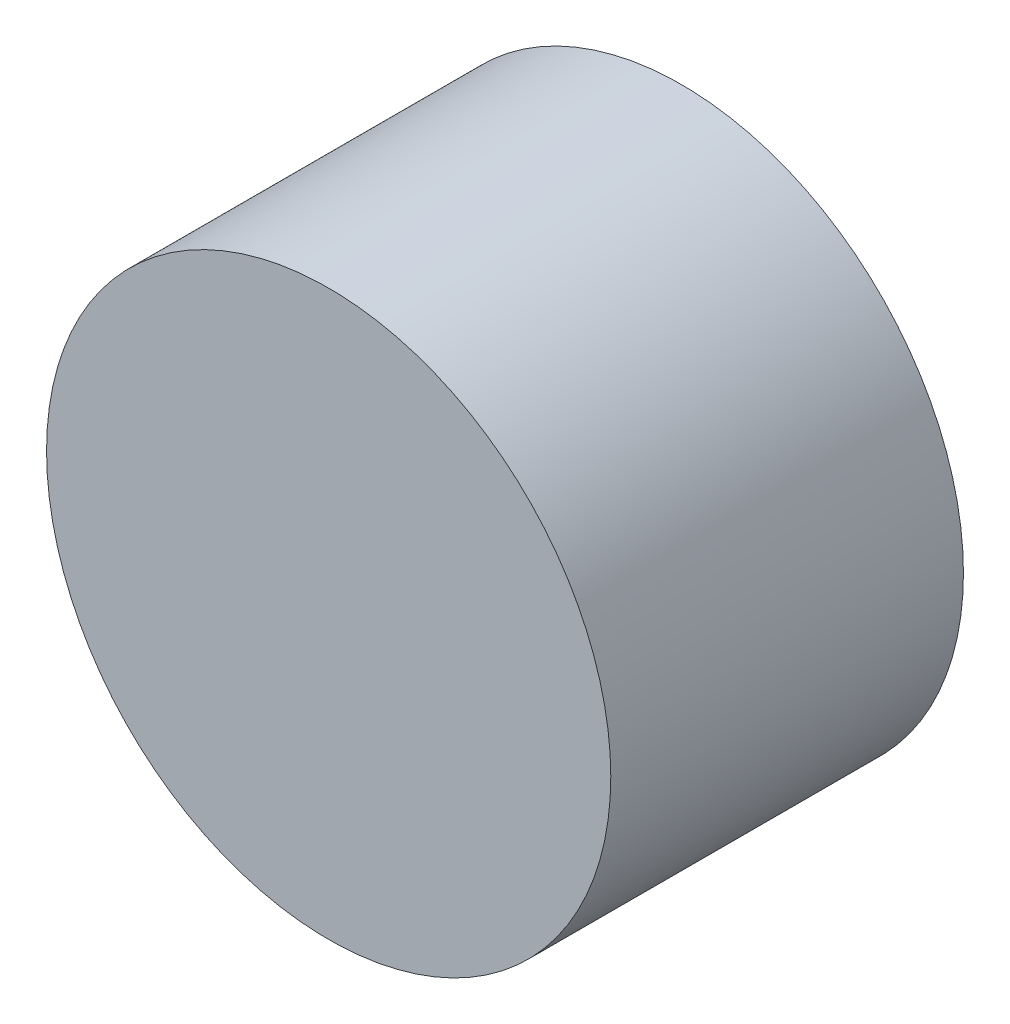
ISO-10303-21;
HEADER;
FILE_DESCRIPTION(('STEP AP214'),'2;1');
FILE_NAME('part.step','',(''),(''),'','','');
FILE_SCHEMA(('AUTOMOTIVE_DESIGN { 1 0 10303 214 1 1 1 1 }'));
ENDSEC;
DATA;
#1=APPLICATION_CONTEXT('core data for automotive mechanical design processes');
#2=APPLICATION_PROTOCOL_DEFINITION('international standard','automotive_design',2000,#1);
#3=PRODUCT_CONTEXT('',#1,'mechanical');
#4=PRODUCT('Part','Part','',(#3));
#5=PRODUCT_RELATED_PRODUCT_CATEGORY('part','',(#4));
#6=PRODUCT_DEFINITION_FORMATION('','',#4);
#7=PRODUCT_DEFINITION_CONTEXT('part definition',#1,'design');
#8=PRODUCT_DEFINITION('design','',#6,#7);
#9=PRODUCT_DEFINITION_SHAPE('','',#8);
#10=(LENGTH_UNIT() NAMED_UNIT(*) SI_UNIT(.MILLI.,.METRE.));
#11=(NAMED_UNIT(*) PLANE_ANGLE_UNIT() SI_UNIT($,.RADIAN.));
#12=(NAMED_UNIT(*) SI_UNIT($,.STERADIAN.) SOLID_ANGLE_UNIT());
#13=UNCERTAINTY_MEASURE_WITH_UNIT(LENGTH_MEASURE(1.E-05),#10,'distance_accuracy_value','');
#14=(GEOMETRIC_REPRESENTATION_CONTEXT(3) GLOBAL_UNCERTAINTY_ASSIGNED_CONTEXT((#13)) GLOBAL_UNIT_ASSIGNED_CONTEXT((#10,
#11,#12)) REPRESENTATION_CONTEXT('',''));
#15=CARTESIAN_POINT('',(0.,0.,0.));
#16=DIRECTION('',(0.,0.,1.));
#17=DIRECTION('',(1.,0.,0.));
#18=AXIS2_PLACEMENT_3D('',#15,#16,#17);
#19=CARTESIAN_POINT('',(0.,0.,5.));
#20=DIRECTION('',(0.,0.,-1.));
#21=DIRECTION('',(-1.,0.,0.));
#22=AXIS2_PLACEMENT_3D('',#19,#20,#21);
#23=CYLINDRICAL_SURFACE('',#22,4.);
#24=CARTESIAN_POINT('',(0.,0.,5.));
#25=DIRECTION('',(0.,0.,1.));
#26=DIRECTION('',(1.,0.,0.));
#27=AXIS2_PLACEMENT_3D('',#24,#25,#26);
#28=CIRCLE('',#27,4.);
#29=CARTESIAN_POINT('',(4.,0.,5.));
#30=VERTEX_POINT('',#29);
#31=EDGE_CURVE('E10',#30,#30,#28,.T.);
#32=ORIENTED_EDGE('',*,*,#31,.F.);
#33=EDGE_LOOP('',(#32));
#34=FACE_BOUND('',#33,.T.);
#35=CARTESIAN_POINT('',(0.,0.,0.));
#36=DIRECTION('',(0.,0.,1.));
#37=DIRECTION('',(1.,0.,0.));
#38=AXIS2_PLACEMENT_3D('',#35,#36,#37);
#39=CIRCLE('',#38,4.);
#40=CARTESIAN_POINT('',(4.,0.,0.));
#41=VERTEX_POINT('',#40);
#42=EDGE_CURVE('E34',#41,#41,#39,.T.);
#43=ORIENTED_EDGE('',*,*,#42,.T.);
#44=EDGE_LOOP('',(#43));
#45=FACE_BOUND('',#44,.T.);
#46=ADVANCED_FACE('F31',(#34,#45),#23,.T.);
#47=CARTESIAN_POINT('',(0.,0.,5.));
#48=DIRECTION('',(0.,0.,1.));
#49=DIRECTION('',(1.,0.,0.));
#50=AXIS2_PLACEMENT_3D('',#47,#48,#49);
#51=PLANE('',#50);
#52=ORIENTED_EDGE('',*,*,#31,.T.);
#53=EDGE_LOOP('',(#52));
#54=FACE_BOUND('',#53,.T.);
#55=ADVANCED_FACE('F46',(#54),#51,.T.);
#56=CARTESIAN_POINT('',(0.,0.,0.));
#57=DIRECTION('',(0.,0.,1.));
#58=DIRECTION('',(1.,0.,0.));
#59=AXIS2_PLACEMENT_3D('',#56,#57,#58);
#60=PLANE('',#59);
#61=ORIENTED_EDGE('',*,*,#42,.F.);
#62=EDGE_LOOP('',(#61));
#63=FACE_BOUND('',#62,.T.);
#64=ADVANCED_FACE('F44',(#63),#60,.F.);
#65=CLOSED_SHELL('',(#46,#55,#64));
#66=MANIFOLD_SOLID_BREP('B2',#65);
#67=ADVANCED_BREP_SHAPE_REPRESENTATION('',(#18,#66),#14);
#68=SHAPE_DEFINITION_REPRESENTATION(#9,#67);
ENDSEC;
END-ISO-10303-21;
